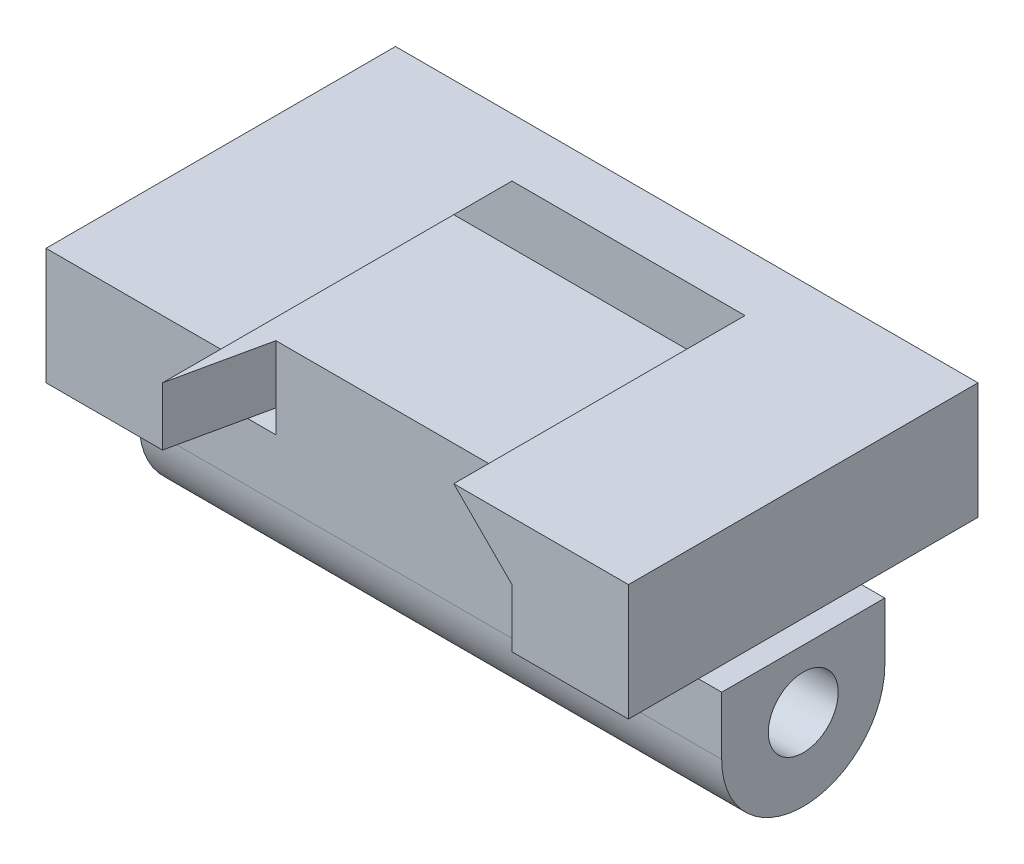
ISO-10303-21;
HEADER;
FILE_DESCRIPTION(('STEP AP214'),'2;1');
FILE_NAME('part.step','',(''),(''),'','','');
FILE_SCHEMA(('AUTOMOTIVE_DESIGN { 1 0 10303 214 1 1 1 1 }'));
ENDSEC;
DATA;
#1=APPLICATION_CONTEXT('core data for automotive mechanical design processes');
#2=APPLICATION_PROTOCOL_DEFINITION('international standard','automotive_design',2000,#1);
#3=PRODUCT_CONTEXT('',#1,'mechanical');
#4=PRODUCT('Part','Part','',(#3));
#5=PRODUCT_RELATED_PRODUCT_CATEGORY('part','',(#4));
#6=PRODUCT_DEFINITION_FORMATION('','',#4);
#7=PRODUCT_DEFINITION_CONTEXT('part definition',#1,'design');
#8=PRODUCT_DEFINITION('design','',#6,#7);
#9=PRODUCT_DEFINITION_SHAPE('','',#8);
#10=(LENGTH_UNIT() NAMED_UNIT(*) SI_UNIT(.MILLI.,.METRE.));
#11=(NAMED_UNIT(*) PLANE_ANGLE_UNIT() SI_UNIT($,.RADIAN.));
#12=(NAMED_UNIT(*) SI_UNIT($,.STERADIAN.) SOLID_ANGLE_UNIT());
#13=UNCERTAINTY_MEASURE_WITH_UNIT(LENGTH_MEASURE(1.E-05),#10,'distance_accuracy_value','');
#14=(GEOMETRIC_REPRESENTATION_CONTEXT(3) GLOBAL_UNCERTAINTY_ASSIGNED_CONTEXT((#13)) GLOBAL_UNIT_ASSIGNED_CONTEXT((#10,
#11,#12)) REPRESENTATION_CONTEXT('',''));
#15=CARTESIAN_POINT('',(0.,0.,0.));
#16=DIRECTION('',(0.,0.,1.));
#17=DIRECTION('',(1.,0.,0.));
#18=AXIS2_PLACEMENT_3D('',#15,#16,#17);
#19=CARTESIAN_POINT('',(0.,5.,0.));
#20=DIRECTION('',(0.,1.,0.));
#21=DIRECTION('',(0.,0.,1.));
#22=AXIS2_PLACEMENT_3D('',#19,#20,#21);
#23=PLANE('',#22);
#24=DIRECTION('',(-1.,0.,0.));
#25=VECTOR('',#24,1.);
#26=CARTESIAN_POINT('',(15.,5.,-10.));
#27=LINE('',#26,#25);
#28=CARTESIAN_POINT('',(15.,5.,-10.));
#29=VERTEX_POINT('',#28);
#30=CARTESIAN_POINT('',(-15.,5.,-10.));
#31=VERTEX_POINT('',#30);
#32=EDGE_CURVE('E162',#29,#31,#27,.T.);
#33=ORIENTED_EDGE('',*,*,#32,.T.);
#34=DIRECTION('',(0.,0.,1.));
#35=VECTOR('',#34,1.);
#36=CARTESIAN_POINT('',(-15.,5.,-15.));
#37=LINE('',#36,#35);
#38=CARTESIAN_POINT('',(-15.,5.,15.));
#39=VERTEX_POINT('',#38);
#40=EDGE_CURVE('E196',#31,#39,#37,.T.);
#41=ORIENTED_EDGE('',*,*,#40,.T.);
#42=DIRECTION('',(0.211772892657065,0.,-0.977318904931067));
#43=VECTOR('',#42,1.);
#44=CARTESIAN_POINT('',(-11.2227388558496,5.,-2.4318284022202));
#45=LINE('',#44,#43);
#46=CARTESIAN_POINT('',(-13.2664991614216,5.,7.));
#47=VERTEX_POINT('',#46);
#48=EDGE_CURVE('E231',#39,#47,#45,.T.);
#49=ORIENTED_EDGE('',*,*,#48,.T.);
#50=DIRECTION('',(1.,0.,0.));
#51=VECTOR('',#50,1.);
#52=CARTESIAN_POINT('',(0.,5.,7.));
#53=LINE('',#52,#51);
#54=CARTESIAN_POINT('',(13.2664991614216,5.,7.));
#55=VERTEX_POINT('',#54);
#56=EDGE_CURVE('E233',#47,#55,#53,.T.);
#57=ORIENTED_EDGE('',*,*,#56,.T.);
#58=DIRECTION('',(-0.211772892657065,0.,-0.977318904931067));
#59=VECTOR('',#58,1.);
#60=CARTESIAN_POINT('',(11.2227388558496,5.,-2.4318284022202));
#61=LINE('',#60,#59);
#62=CARTESIAN_POINT('',(15.,5.,15.));
#63=VERTEX_POINT('',#62);
#64=EDGE_CURVE('E182',#63,#55,#61,.T.);
#65=ORIENTED_EDGE('',*,*,#64,.F.);
#66=DIRECTION('',(0.,0.,1.));
#67=VECTOR('',#66,1.);
#68=CARTESIAN_POINT('',(15.,5.,-15.));
#69=LINE('',#68,#67);
#70=EDGE_CURVE('E176',#29,#63,#69,.T.);
#71=ORIENTED_EDGE('',*,*,#70,.F.);
#72=EDGE_LOOP('',(#33,#41,#49,#57,#65,#71));
#73=FACE_BOUND('',#72,.T.);
#74=ADVANCED_FACE('F38',(#73),#23,.T.);
#75=CARTESIAN_POINT('',(0.,5.,15.));
#76=DIRECTION('',(0.,0.,-1.));
#77=DIRECTION('',(-1.,0.,0.));
#78=AXIS2_PLACEMENT_3D('',#75,#76,#77);
#79=PLANE('',#78);
#80=DIRECTION('',(1.,0.,0.));
#81=VECTOR('',#80,1.);
#82=CARTESIAN_POINT('',(0.,0.,15.));
#83=LINE('',#82,#81);
#84=CARTESIAN_POINT('',(-25.,0.,15.));
#85=VERTEX_POINT('',#84);
#86=CARTESIAN_POINT('',(-15.,0.,15.));
#87=VERTEX_POINT('',#86);
#88=EDGE_CURVE('E230',#85,#87,#83,.T.);
#89=ORIENTED_EDGE('',*,*,#88,.T.);
#90=DIRECTION('',(0.,-1.,0.));
#91=VECTOR('',#90,1.);
#92=CARTESIAN_POINT('',(-15.,5.,15.));
#93=LINE('',#92,#91);
#94=EDGE_CURVE('E11',#39,#87,#93,.T.);
#95=ORIENTED_EDGE('',*,*,#94,.F.);
#96=DIRECTION('',(0.707106781186539,0.707106781186556,0.));
#97=VECTOR('',#96,1.);
#98=CARTESIAN_POINT('',(-10.0000000000002,9.99999999999994,15.));
#99=LINE('',#98,#97);
#100=CARTESIAN_POINT('',(-10.0000000000001,10.,15.));
#101=VERTEX_POINT('',#100);
#102=EDGE_CURVE('E198',#39,#101,#99,.T.);
#103=ORIENTED_EDGE('',*,*,#102,.T.);
#104=DIRECTION('',(1.,0.,0.));
#105=VECTOR('',#104,1.);
#106=CARTESIAN_POINT('',(0.,10.,15.));
#107=LINE('',#106,#105);
#108=CARTESIAN_POINT('',(-25.,10.,15.));
#109=VERTEX_POINT('',#108);
#110=EDGE_CURVE('E197',#109,#101,#107,.T.);
#111=ORIENTED_EDGE('',*,*,#110,.F.);
#112=DIRECTION('',(0.,-1.,0.));
#113=VECTOR('',#112,1.);
#114=CARTESIAN_POINT('',(-25.,5.,15.));
#115=LINE('',#114,#113);
#116=EDGE_CURVE('E237',#109,#85,#115,.T.);
#117=ORIENTED_EDGE('',*,*,#116,.T.);
#118=EDGE_LOOP('',(#89,#95,#103,#111,#117));
#119=FACE_BOUND('',#118,.T.);
#120=ADVANCED_FACE('F40',(#119),#79,.F.);
#121=CARTESIAN_POINT('',(-11.2227388558496,5.,-2.4318284022202));
#122=DIRECTION('',(-0.977318904931067,0.,-0.211772892657065));
#123=DIRECTION('',(-0.211772892657065,0.,0.977318904931067));
#124=AXIS2_PLACEMENT_3D('',#121,#122,#123);
#125=PLANE('',#124);
#126=DIRECTION('',(0.211772892657065,0.,-0.977318904931067));
#127=VECTOR('',#126,1.);
#128=CARTESIAN_POINT('',(-11.2227388558496,0.,-2.4318284022202));
#129=LINE('',#128,#127);
#130=CARTESIAN_POINT('',(-13.2664991614216,0.,7.));
#131=VERTEX_POINT('',#130);
#132=EDGE_CURVE('E240',#87,#131,#129,.T.);
#133=ORIENTED_EDGE('',*,*,#132,.T.);
#134=DIRECTION('',(0.,-1.,0.));
#135=VECTOR('',#134,1.);
#136=CARTESIAN_POINT('',(-13.2664991614216,5.,7.));
#137=LINE('',#136,#135);
#138=EDGE_CURVE('E46',#47,#131,#137,.T.);
#139=ORIENTED_EDGE('',*,*,#138,.F.);
#140=ORIENTED_EDGE('',*,*,#48,.F.);
#141=ORIENTED_EDGE('',*,*,#94,.T.);
#142=EDGE_LOOP('',(#133,#139,#140,#141));
#143=FACE_BOUND('',#142,.T.);
#144=ADVANCED_FACE('F324',(#143),#125,.F.);
#145=CARTESIAN_POINT('',(0.,5.,7.));
#146=DIRECTION('',(0.,0.,-1.));
#147=DIRECTION('',(-1.,0.,0.));
#148=AXIS2_PLACEMENT_3D('',#145,#146,#147);
#149=PLANE('',#148);
#150=ORIENTED_EDGE('',*,*,#138,.T.);
#151=DIRECTION('',(0.,1.,0.));
#152=VECTOR('',#151,1.);
#153=CARTESIAN_POINT('',(-13.2664991614216,-2.,7.));
#154=LINE('',#153,#152);
#155=CARTESIAN_POINT('',(-13.2664991614216,-2.,7.));
#156=VERTEX_POINT('',#155);
#157=EDGE_CURVE('E221',#156,#131,#154,.T.);
#158=ORIENTED_EDGE('',*,*,#157,.F.);
#159=DIRECTION('',(1.,0.,0.));
#160=VECTOR('',#159,1.);
#161=CARTESIAN_POINT('',(-25.,-2.,7.00000000000001));
#162=LINE('',#161,#160);
#163=CARTESIAN_POINT('',(-25.,-2.,7.00000000000001));
#164=VERTEX_POINT('',#163);
#165=EDGE_CURVE('E283',#164,#156,#162,.T.);
#166=ORIENTED_EDGE('',*,*,#165,.F.);
#167=DIRECTION('',(0.,-1.,0.));
#168=VECTOR('',#167,1.);
#169=CARTESIAN_POINT('',(-25.,-7.,7.00000000000001));
#170=LINE('',#169,#168);
#171=CARTESIAN_POINT('',(-25.,-7.,7.00000000000001));
#172=VERTEX_POINT('',#171);
#173=EDGE_CURVE('E300',#164,#172,#170,.T.);
#174=ORIENTED_EDGE('',*,*,#173,.T.);
#175=DIRECTION('',(1.,0.,0.));
#176=VECTOR('',#175,1.);
#177=CARTESIAN_POINT('',(-25.,-7.,7.00000000000001));
#178=LINE('',#177,#176);
#179=CARTESIAN_POINT('',(25.,-7.,7.00000000000001));
#180=VERTEX_POINT('',#179);
#181=EDGE_CURVE('E289',#172,#180,#178,.T.);
#182=ORIENTED_EDGE('',*,*,#181,.T.);
#183=DIRECTION('',(0.,-1.,0.));
#184=VECTOR('',#183,1.);
#185=CARTESIAN_POINT('',(25.,-7.,7.00000000000001));
#186=LINE('',#185,#184);
#187=CARTESIAN_POINT('',(25.,-2.,7.00000000000001));
#188=VERTEX_POINT('',#187);
#189=EDGE_CURVE('E342',#188,#180,#186,.T.);
#190=ORIENTED_EDGE('',*,*,#189,.F.);
#191=CARTESIAN_POINT('',(13.2664991614216,-2.,7.));
#192=VERTEX_POINT('',#191);
#193=EDGE_CURVE('E290',#192,#188,#162,.T.);
#194=ORIENTED_EDGE('',*,*,#193,.F.);
#195=DIRECTION('',(0.,1.,0.));
#196=VECTOR('',#195,1.);
#197=CARTESIAN_POINT('',(13.2664991614216,-2.,7.));
#198=LINE('',#197,#196);
#199=CARTESIAN_POINT('',(13.2664991614216,0.,7.));
#200=VERTEX_POINT('',#199);
#201=EDGE_CURVE('E224',#192,#200,#198,.T.);
#202=ORIENTED_EDGE('',*,*,#201,.T.);
#203=DIRECTION('',(0.,-1.,0.));
#204=VECTOR('',#203,1.);
#205=CARTESIAN_POINT('',(13.2664991614216,5.,7.));
#206=LINE('',#205,#204);
#207=EDGE_CURVE('E265',#55,#200,#206,.T.);
#208=ORIENTED_EDGE('',*,*,#207,.F.);
#209=ORIENTED_EDGE('',*,*,#56,.F.);
#210=EDGE_LOOP('',(#150,#158,#166,#174,#182,#190,#194,#202,#208,#209));
#211=FACE_BOUND('',#210,.T.);
#212=ADVANCED_FACE('F271',(#211),#149,.F.);
#213=CARTESIAN_POINT('',(11.2227388558496,5.,-2.4318284022202));
#214=DIRECTION('',(-0.977318904931067,0.,0.211772892657065));
#215=DIRECTION('',(0.211772892657065,0.,0.977318904931067));
#216=AXIS2_PLACEMENT_3D('',#213,#214,#215);
#217=PLANE('',#216);
#218=DIRECTION('',(-0.211772892657065,0.,-0.977318904931067));
#219=VECTOR('',#218,1.);
#220=CARTESIAN_POINT('',(11.2227388558496,0.,-2.4318284022202));
#221=LINE('',#220,#219);
#222=CARTESIAN_POINT('',(15.,0.,15.));
#223=VERTEX_POINT('',#222);
#224=EDGE_CURVE('E243',#223,#200,#221,.T.);
#225=ORIENTED_EDGE('',*,*,#224,.F.);
#226=DIRECTION('',(0.,-1.,0.));
#227=VECTOR('',#226,1.);
#228=CARTESIAN_POINT('',(15.,5.,15.));
#229=LINE('',#228,#227);
#230=EDGE_CURVE('E263',#63,#223,#229,.T.);
#231=ORIENTED_EDGE('',*,*,#230,.F.);
#232=ORIENTED_EDGE('',*,*,#64,.T.);
#233=ORIENTED_EDGE('',*,*,#207,.T.);
#234=EDGE_LOOP('',(#225,#231,#232,#233));
#235=FACE_BOUND('',#234,.T.);
#236=ADVANCED_FACE('F376',(#235),#217,.T.);
#237=CARTESIAN_POINT('',(0.,5.,15.));
#238=DIRECTION('',(0.,0.,1.));
#239=DIRECTION('',(1.,0.,0.));
#240=AXIS2_PLACEMENT_3D('',#237,#238,#239);
#241=PLANE('',#240);
#242=DIRECTION('',(-1.,0.,0.));
#243=VECTOR('',#242,1.);
#244=CARTESIAN_POINT('',(0.,0.,15.));
#245=LINE('',#244,#243);
#246=CARTESIAN_POINT('',(25.,0.,15.));
#247=VERTEX_POINT('',#246);
#248=EDGE_CURVE('E245',#247,#223,#245,.T.);
#249=ORIENTED_EDGE('',*,*,#248,.F.);
#250=DIRECTION('',(0.,-1.,0.));
#251=VECTOR('',#250,1.);
#252=CARTESIAN_POINT('',(25.,5.,15.));
#253=LINE('',#252,#251);
#254=CARTESIAN_POINT('',(25.,10.,15.));
#255=VERTEX_POINT('',#254);
#256=EDGE_CURVE('E261',#255,#247,#253,.T.);
#257=ORIENTED_EDGE('',*,*,#256,.F.);
#258=DIRECTION('',(1.,0.,0.));
#259=VECTOR('',#258,1.);
#260=CARTESIAN_POINT('',(0.,10.,15.));
#261=LINE('',#260,#259);
#262=CARTESIAN_POINT('',(10.0000000000001,10.,15.));
#263=VERTEX_POINT('',#262);
#264=EDGE_CURVE('E185',#263,#255,#261,.T.);
#265=ORIENTED_EDGE('',*,*,#264,.F.);
#266=DIRECTION('',(-0.707106781186539,0.707106781186556,0.));
#267=VECTOR('',#266,1.);
#268=CARTESIAN_POINT('',(10.0000000000002,9.99999999999994,15.));
#269=LINE('',#268,#267);
#270=EDGE_CURVE('E190',#63,#263,#269,.T.);
#271=ORIENTED_EDGE('',*,*,#270,.F.);
#272=ORIENTED_EDGE('',*,*,#230,.T.);
#273=EDGE_LOOP('',(#249,#257,#265,#271,#272));
#274=FACE_BOUND('',#273,.T.);
#275=ADVANCED_FACE('F306',(#274),#241,.T.);
#276=CARTESIAN_POINT('',(25.,5.,0.));
#277=DIRECTION('',(1.,0.,0.));
#278=DIRECTION('',(0.,0.,-1.));
#279=AXIS2_PLACEMENT_3D('',#276,#277,#278);
#280=PLANE('',#279);
#281=DIRECTION('',(0.,0.,1.));
#282=VECTOR('',#281,1.);
#283=CARTESIAN_POINT('',(25.,0.,0.));
#284=LINE('',#283,#282);
#285=CARTESIAN_POINT('',(25.,0.,-15.));
#286=VERTEX_POINT('',#285);
#287=EDGE_CURVE('E248',#286,#247,#284,.T.);
#288=ORIENTED_EDGE('',*,*,#287,.F.);
#289=DIRECTION('',(0.,-1.,0.));
#290=VECTOR('',#289,1.);
#291=CARTESIAN_POINT('',(25.,5.,-15.));
#292=LINE('',#291,#290);
#293=CARTESIAN_POINT('',(25.,10.,-15.));
#294=VERTEX_POINT('',#293);
#295=EDGE_CURVE('E259',#294,#286,#292,.T.);
#296=ORIENTED_EDGE('',*,*,#295,.F.);
#297=DIRECTION('',(0.,0.,1.));
#298=VECTOR('',#297,1.);
#299=CARTESIAN_POINT('',(25.,10.,-15.));
#300=LINE('',#299,#298);
#301=EDGE_CURVE('E184',#294,#255,#300,.T.);
#302=ORIENTED_EDGE('',*,*,#301,.T.);
#303=ORIENTED_EDGE('',*,*,#256,.T.);
#304=EDGE_LOOP('',(#288,#296,#302,#303));
#305=FACE_BOUND('',#304,.T.);
#306=ADVANCED_FACE('F310',(#305),#280,.T.);
#307=CARTESIAN_POINT('',(0.,5.,-15.));
#308=DIRECTION('',(0.,0.,1.));
#309=DIRECTION('',(1.,0.,0.));
#310=AXIS2_PLACEMENT_3D('',#307,#308,#309);
#311=PLANE('',#310);
#312=DIRECTION('',(1.,0.,0.));
#313=VECTOR('',#312,1.);
#314=CARTESIAN_POINT('',(0.,10.,-15.));
#315=LINE('',#314,#313);
#316=CARTESIAN_POINT('',(-25.,10.,-15.));
#317=VERTEX_POINT('',#316);
#318=EDGE_CURVE('E194',#317,#294,#315,.T.);
#319=ORIENTED_EDGE('',*,*,#318,.T.);
#320=ORIENTED_EDGE('',*,*,#295,.T.);
#321=DIRECTION('',(-1.,0.,0.));
#322=VECTOR('',#321,1.);
#323=CARTESIAN_POINT('',(0.,0.,-15.));
#324=LINE('',#323,#322);
#325=CARTESIAN_POINT('',(-25.,0.,-15.));
#326=VERTEX_POINT('',#325);
#327=EDGE_CURVE('E251',#286,#326,#324,.T.);
#328=ORIENTED_EDGE('',*,*,#327,.T.);
#329=DIRECTION('',(0.,-1.,0.));
#330=VECTOR('',#329,1.);
#331=CARTESIAN_POINT('',(-25.,5.,-15.));
#332=LINE('',#331,#330);
#333=EDGE_CURVE('E256',#317,#326,#332,.T.);
#334=ORIENTED_EDGE('',*,*,#333,.F.);
#335=EDGE_LOOP('',(#319,#320,#328,#334));
#336=FACE_BOUND('',#335,.T.);
#337=ADVANCED_FACE('F315',(#336),#311,.F.);
#338=CARTESIAN_POINT('',(-25.,5.,0.));
#339=DIRECTION('',(1.,0.,0.));
#340=DIRECTION('',(0.,0.,-1.));
#341=AXIS2_PLACEMENT_3D('',#338,#339,#340);
#342=PLANE('',#341);
#343=DIRECTION('',(0.,0.,1.));
#344=VECTOR('',#343,1.);
#345=CARTESIAN_POINT('',(-25.,0.,0.));
#346=LINE('',#345,#344);
#347=EDGE_CURVE('E234',#326,#85,#346,.T.);
#348=ORIENTED_EDGE('',*,*,#347,.T.);
#349=ORIENTED_EDGE('',*,*,#116,.F.);
#350=DIRECTION('',(0.,0.,1.));
#351=VECTOR('',#350,1.);
#352=CARTESIAN_POINT('',(-25.,10.,-15.));
#353=LINE('',#352,#351);
#354=EDGE_CURVE('E203',#317,#109,#353,.T.);
#355=ORIENTED_EDGE('',*,*,#354,.F.);
#356=ORIENTED_EDGE('',*,*,#333,.T.);
#357=EDGE_LOOP('',(#348,#349,#355,#356));
#358=FACE_BOUND('',#357,.T.);
#359=ADVANCED_FACE('F319',(#358),#342,.F.);
#360=CARTESIAN_POINT('',(0.,0.,0.));
#361=DIRECTION('',(0.,1.,0.));
#362=DIRECTION('',(0.,0.,1.));
#363=AXIS2_PLACEMENT_3D('',#360,#361,#362);
#364=PLANE('',#363);
#365=CARTESIAN_POINT('',(0.,0.,0.));
#366=DIRECTION('',(0.,-1.,0.));
#367=DIRECTION('',(0.,0.,-1.));
#368=AXIS2_PLACEMENT_3D('',#365,#366,#367);
#369=CIRCLE('',#368,15.);
#370=CARTESIAN_POINT('',(-13.2664991614216,0.,-7.));
#371=VERTEX_POINT('',#370);
#372=EDGE_CURVE('E213',#131,#371,#369,.T.);
#373=ORIENTED_EDGE('',*,*,#372,.F.);
#374=ORIENTED_EDGE('',*,*,#132,.F.);
#375=ORIENTED_EDGE('',*,*,#88,.F.);
#376=ORIENTED_EDGE('',*,*,#347,.F.);
#377=ORIENTED_EDGE('',*,*,#327,.F.);
#378=ORIENTED_EDGE('',*,*,#287,.T.);
#379=ORIENTED_EDGE('',*,*,#248,.T.);
#380=ORIENTED_EDGE('',*,*,#224,.T.);
#381=CARTESIAN_POINT('',(13.2664991614216,0.,-7.));
#382=VERTEX_POINT('',#381);
#383=EDGE_CURVE('E215',#382,#200,#369,.T.);
#384=ORIENTED_EDGE('',*,*,#383,.F.);
#385=DIRECTION('',(1.,0.,0.));
#386=VECTOR('',#385,1.);
#387=CARTESIAN_POINT('',(0.,0.,-7.));
#388=LINE('',#387,#386);
#389=EDGE_CURVE('E61',#371,#382,#388,.T.);
#390=ORIENTED_EDGE('',*,*,#389,.F.);
#391=EDGE_LOOP('',(#373,#374,#375,#376,#377,#378,#379,#380,#384,#390));
#392=FACE_BOUND('',#391,.T.);
#393=ADVANCED_FACE('F323',(#392),#364,.F.);
#394=CARTESIAN_POINT('',(0.,-2.,-7.));
#395=DIRECTION('',(0.,0.,1.));
#396=DIRECTION('',(1.,0.,0.));
#397=AXIS2_PLACEMENT_3D('',#394,#395,#396);
#398=PLANE('',#397);
#399=ORIENTED_EDGE('',*,*,#389,.T.);
#400=DIRECTION('',(0.,1.,0.));
#401=VECTOR('',#400,1.);
#402=CARTESIAN_POINT('',(13.2664991614216,-2.,-7.));
#403=LINE('',#402,#401);
#404=CARTESIAN_POINT('',(13.2664991614216,-2.,-7.));
#405=VERTEX_POINT('',#404);
#406=EDGE_CURVE('E227',#405,#382,#403,.T.);
#407=ORIENTED_EDGE('',*,*,#406,.F.);
#408=DIRECTION('',(1.,0.,0.));
#409=VECTOR('',#408,1.);
#410=CARTESIAN_POINT('',(-25.,-2.,-6.99999999999999));
#411=LINE('',#410,#409);
#412=CARTESIAN_POINT('',(25.,-2.,-6.99999999999999));
#413=VERTEX_POINT('',#412);
#414=EDGE_CURVE('E297',#405,#413,#411,.T.);
#415=ORIENTED_EDGE('',*,*,#414,.T.);
#416=DIRECTION('',(0.,1.,0.));
#417=VECTOR('',#416,1.);
#418=CARTESIAN_POINT('',(25.,-2.,-6.99999999999999));
#419=LINE('',#418,#417);
#420=CARTESIAN_POINT('',(25.,-7.,-6.99999999999999));
#421=VERTEX_POINT('',#420);
#422=EDGE_CURVE('E349',#421,#413,#419,.T.);
#423=ORIENTED_EDGE('',*,*,#422,.F.);
#424=DIRECTION('',(1.,0.,0.));
#425=VECTOR('',#424,1.);
#426=CARTESIAN_POINT('',(-25.,-7.,-6.99999999999999));
#427=LINE('',#426,#425);
#428=CARTESIAN_POINT('',(-25.,-7.,-6.99999999999999));
#429=VERTEX_POINT('',#428);
#430=EDGE_CURVE('E298',#429,#421,#427,.T.);
#431=ORIENTED_EDGE('',*,*,#430,.F.);
#432=DIRECTION('',(0.,1.,0.));
#433=VECTOR('',#432,1.);
#434=CARTESIAN_POINT('',(-25.,-2.,-6.99999999999999));
#435=LINE('',#434,#433);
#436=CARTESIAN_POINT('',(-25.,-2.,-6.99999999999999));
#437=VERTEX_POINT('',#436);
#438=EDGE_CURVE('E341',#429,#437,#435,.T.);
#439=ORIENTED_EDGE('',*,*,#438,.T.);
#440=CARTESIAN_POINT('',(-13.2664991614216,-2.,-6.99999999999999));
#441=VERTEX_POINT('',#440);
#442=EDGE_CURVE('E293',#437,#441,#411,.T.);
#443=ORIENTED_EDGE('',*,*,#442,.T.);
#444=DIRECTION('',(0.,1.,0.));
#445=VECTOR('',#444,1.);
#446=CARTESIAN_POINT('',(-13.2664991614216,-2.,-7.));
#447=LINE('',#446,#445);
#448=EDGE_CURVE('E218',#441,#371,#447,.T.);
#449=ORIENTED_EDGE('',*,*,#448,.T.);
#450=EDGE_LOOP('',(#399,#407,#415,#423,#431,#439,#443,#449));
#451=FACE_BOUND('',#450,.T.);
#452=ADVANCED_FACE('F367',(#451),#398,.F.);
#453=CARTESIAN_POINT('',(0.,-2.,0.));
#454=DIRECTION('',(0.,1.,0.));
#455=DIRECTION('',(0.,0.,1.));
#456=AXIS2_PLACEMENT_3D('',#453,#454,#455);
#457=CYLINDRICAL_SURFACE('',#456,15.);
#458=ORIENTED_EDGE('',*,*,#383,.T.);
#459=ORIENTED_EDGE('',*,*,#201,.F.);
#460=CARTESIAN_POINT('',(0.,-2.,0.));
#461=DIRECTION('',(0.,-1.,0.));
#462=DIRECTION('',(0.,0.,-1.));
#463=AXIS2_PLACEMENT_3D('',#460,#461,#462);
#464=CIRCLE('',#463,15.);
#465=EDGE_CURVE('E209',#405,#192,#464,.T.);
#466=ORIENTED_EDGE('',*,*,#465,.F.);
#467=ORIENTED_EDGE('',*,*,#406,.T.);
#468=EDGE_LOOP('',(#458,#459,#466,#467));
#469=FACE_BOUND('',#468,.T.);
#470=ADVANCED_FACE('F373',(#469),#457,.T.);
#471=ORIENTED_EDGE('',*,*,#372,.T.);
#472=ORIENTED_EDGE('',*,*,#448,.F.);
#473=EDGE_CURVE('E212',#156,#441,#464,.T.);
#474=ORIENTED_EDGE('',*,*,#473,.F.);
#475=ORIENTED_EDGE('',*,*,#157,.T.);
#476=EDGE_LOOP('',(#471,#472,#474,#475));
#477=FACE_BOUND('',#476,.T.);
#478=ADVANCED_FACE('F277',(#477),#457,.T.);
#479=CARTESIAN_POINT('',(0.,10.,-15.));
#480=DIRECTION('',(0.,-1.,0.));
#481=DIRECTION('',(0.,0.,-1.));
#482=AXIS2_PLACEMENT_3D('',#479,#480,#481);
#483=PLANE('',#482);
#484=ORIENTED_EDGE('',*,*,#110,.T.);
#485=DIRECTION('',(0.,0.,1.));
#486=VECTOR('',#485,1.);
#487=CARTESIAN_POINT('',(-10.0000000000001,10.,-15.));
#488=LINE('',#487,#486);
#489=CARTESIAN_POINT('',(-10.0000000000001,10.,-10.));
#490=VERTEX_POINT('',#489);
#491=EDGE_CURVE('E206',#490,#101,#488,.T.);
#492=ORIENTED_EDGE('',*,*,#491,.F.);
#493=DIRECTION('',(1.,0.,0.));
#494=VECTOR('',#493,1.);
#495=CARTESIAN_POINT('',(-10.0000000000001,10.,-10.));
#496=LINE('',#495,#494);
#497=CARTESIAN_POINT('',(10.0000000000001,10.,-10.));
#498=VERTEX_POINT('',#497);
#499=EDGE_CURVE('E53',#490,#498,#496,.T.);
#500=ORIENTED_EDGE('',*,*,#499,.T.);
#501=DIRECTION('',(0.,0.,1.));
#502=VECTOR('',#501,1.);
#503=CARTESIAN_POINT('',(10.0000000000001,10.,-15.));
#504=LINE('',#503,#502);
#505=EDGE_CURVE('E178',#498,#263,#504,.T.);
#506=ORIENTED_EDGE('',*,*,#505,.T.);
#507=ORIENTED_EDGE('',*,*,#264,.T.);
#508=ORIENTED_EDGE('',*,*,#301,.F.);
#509=ORIENTED_EDGE('',*,*,#318,.F.);
#510=ORIENTED_EDGE('',*,*,#354,.T.);
#511=EDGE_LOOP('',(#484,#492,#500,#506,#507,#508,#509,#510));
#512=FACE_BOUND('',#511,.T.);
#513=ADVANCED_FACE('F302',(#512),#483,.F.);
#514=CARTESIAN_POINT('',(-10.0000000000002,9.99999999999994,-15.));
#515=DIRECTION('',(0.707106781186556,-0.707106781186539,0.));
#516=DIRECTION('',(0.707106781186539,0.707106781186556,0.));
#517=AXIS2_PLACEMENT_3D('',#514,#515,#516);
#518=PLANE('',#517);
#519=DIRECTION('',(0.707106781186539,0.707106781186556,0.));
#520=VECTOR('',#519,1.);
#521=CARTESIAN_POINT('',(-15.,5.,-10.));
#522=LINE('',#521,#520);
#523=EDGE_CURVE('E168',#31,#490,#522,.T.);
#524=ORIENTED_EDGE('',*,*,#523,.T.);
#525=ORIENTED_EDGE('',*,*,#491,.T.);
#526=ORIENTED_EDGE('',*,*,#102,.F.);
#527=ORIENTED_EDGE('',*,*,#40,.F.);
#528=EDGE_LOOP('',(#524,#525,#526,#527));
#529=FACE_BOUND('',#528,.T.);
#530=ADVANCED_FACE('F327',(#529),#518,.T.);
#531=CARTESIAN_POINT('',(10.0000000000002,9.99999999999994,-15.));
#532=DIRECTION('',(0.707106781186556,0.707106781186539,0.));
#533=DIRECTION('',(-0.707106781186539,0.707106781186556,0.));
#534=AXIS2_PLACEMENT_3D('',#531,#532,#533);
#535=PLANE('',#534);
#536=ORIENTED_EDGE('',*,*,#505,.F.);
#537=DIRECTION('',(0.707106781186539,-0.707106781186556,0.));
#538=VECTOR('',#537,1.);
#539=CARTESIAN_POINT('',(10.0000000000001,10.,-10.));
#540=LINE('',#539,#538);
#541=EDGE_CURVE('E165',#498,#29,#540,.T.);
#542=ORIENTED_EDGE('',*,*,#541,.T.);
#543=ORIENTED_EDGE('',*,*,#70,.T.);
#544=ORIENTED_EDGE('',*,*,#270,.T.);
#545=EDGE_LOOP('',(#536,#542,#543,#544));
#546=FACE_BOUND('',#545,.T.);
#547=ADVANCED_FACE('F174',(#546),#535,.F.);
#548=CARTESIAN_POINT('',(-25.,-2.,7.00000000000001));
#549=DIRECTION('',(0.,1.,0.));
#550=DIRECTION('',(0.,0.,1.));
#551=AXIS2_PLACEMENT_3D('',#548,#549,#550);
#552=PLANE('',#551);
#553=ORIENTED_EDGE('',*,*,#414,.F.);
#554=ORIENTED_EDGE('',*,*,#465,.T.);
#555=ORIENTED_EDGE('',*,*,#193,.T.);
#556=DIRECTION('',(0.,0.,1.));
#557=VECTOR('',#556,1.);
#558=CARTESIAN_POINT('',(25.,-2.,7.00000000000001));
#559=LINE('',#558,#557);
#560=EDGE_CURVE('E352',#413,#188,#559,.T.);
#561=ORIENTED_EDGE('',*,*,#560,.F.);
#562=EDGE_LOOP('',(#553,#554,#555,#561));
#563=FACE_BOUND('',#562,.T.);
#564=ADVANCED_FACE('F371',(#563),#552,.T.);
#565=CARTESIAN_POINT('',(-25.,-7.,0.));
#566=DIRECTION('',(1.,0.,0.));
#567=DIRECTION('',(0.,0.,-1.));
#568=AXIS2_PLACEMENT_3D('',#565,#566,#567);
#569=CYLINDRICAL_SURFACE('',#568,7.);
#570=CARTESIAN_POINT('',(25.,-7.,0.));
#571=DIRECTION('',(1.,0.,0.));
#572=DIRECTION('',(0.,0.,-1.));
#573=AXIS2_PLACEMENT_3D('',#570,#571,#572);
#574=CIRCLE('',#573,7.);
#575=EDGE_CURVE('E335',#180,#421,#574,.T.);
#576=ORIENTED_EDGE('',*,*,#575,.F.);
#577=ORIENTED_EDGE('',*,*,#181,.F.);
#578=CARTESIAN_POINT('',(-25.,-7.,0.));
#579=DIRECTION('',(1.,0.,0.));
#580=DIRECTION('',(0.,0.,-1.));
#581=AXIS2_PLACEMENT_3D('',#578,#579,#580);
#582=CIRCLE('',#581,7.);
#583=EDGE_CURVE('E338',#172,#429,#582,.T.);
#584=ORIENTED_EDGE('',*,*,#583,.T.);
#585=ORIENTED_EDGE('',*,*,#430,.T.);
#586=EDGE_LOOP('',(#576,#577,#584,#585));
#587=FACE_BOUND('',#586,.T.);
#588=ADVANCED_FACE('F363',(#587),#569,.T.);
#589=ORIENTED_EDGE('',*,*,#165,.T.);
#590=ORIENTED_EDGE('',*,*,#473,.T.);
#591=ORIENTED_EDGE('',*,*,#442,.F.);
#592=DIRECTION('',(0.,0.,1.));
#593=VECTOR('',#592,1.);
#594=CARTESIAN_POINT('',(-25.,-2.,7.00000000000001));
#595=LINE('',#594,#593);
#596=EDGE_CURVE('E286',#437,#164,#595,.T.);
#597=ORIENTED_EDGE('',*,*,#596,.T.);
#598=EDGE_LOOP('',(#589,#590,#591,#597));
#599=FACE_BOUND('',#598,.T.);
#600=ADVANCED_FACE('F284',(#599),#552,.T.);
#601=CARTESIAN_POINT('',(-25.,-7.,0.));
#602=DIRECTION('',(1.,0.,0.));
#603=DIRECTION('',(0.,0.,-1.));
#604=AXIS2_PLACEMENT_3D('',#601,#602,#603);
#605=PLANE('',#604);
#606=CARTESIAN_POINT('',(-25.,-7.,0.));
#607=DIRECTION('',(1.,0.,0.));
#608=DIRECTION('',(0.,0.,-1.));
#609=AXIS2_PLACEMENT_3D('',#606,#607,#608);
#610=CIRCLE('',#609,3.);
#611=CARTESIAN_POINT('',(-25.,-7.,-2.99999999999999));
#612=VERTEX_POINT('',#611);
#613=EDGE_CURVE('E332',#612,#612,#610,.T.);
#614=ORIENTED_EDGE('',*,*,#613,.T.);
#615=EDGE_LOOP('',(#614));
#616=FACE_BOUND('',#615,.T.);
#617=ORIENTED_EDGE('',*,*,#583,.F.);
#618=ORIENTED_EDGE('',*,*,#173,.F.);
#619=ORIENTED_EDGE('',*,*,#596,.F.);
#620=ORIENTED_EDGE('',*,*,#438,.F.);
#621=EDGE_LOOP('',(#617,#618,#619,#620));
#622=FACE_BOUND('',#621,.T.);
#623=ADVANCED_FACE('F470',(#616,#622),#605,.F.);
#624=CARTESIAN_POINT('',(25.,-7.,0.));
#625=DIRECTION('',(1.,0.,0.));
#626=DIRECTION('',(0.,0.,-1.));
#627=AXIS2_PLACEMENT_3D('',#624,#625,#626);
#628=PLANE('',#627);
#629=CARTESIAN_POINT('',(25.,-7.,0.));
#630=DIRECTION('',(1.,0.,0.));
#631=DIRECTION('',(0.,0.,-1.));
#632=AXIS2_PLACEMENT_3D('',#629,#630,#631);
#633=CIRCLE('',#632,3.);
#634=CARTESIAN_POINT('',(25.,-7.,-2.99999999999999));
#635=VERTEX_POINT('',#634);
#636=EDGE_CURVE('E329',#635,#635,#633,.T.);
#637=ORIENTED_EDGE('',*,*,#636,.F.);
#638=EDGE_LOOP('',(#637));
#639=FACE_BOUND('',#638,.T.);
#640=ORIENTED_EDGE('',*,*,#575,.T.);
#641=ORIENTED_EDGE('',*,*,#422,.T.);
#642=ORIENTED_EDGE('',*,*,#560,.T.);
#643=ORIENTED_EDGE('',*,*,#189,.T.);
#644=EDGE_LOOP('',(#640,#641,#642,#643));
#645=FACE_BOUND('',#644,.T.);
#646=ADVANCED_FACE('F357',(#639,#645),#628,.T.);
#647=CARTESIAN_POINT('',(-25.,-7.,0.));
#648=DIRECTION('',(1.,0.,0.));
#649=DIRECTION('',(0.,0.,-1.));
#650=AXIS2_PLACEMENT_3D('',#647,#648,#649);
#651=CYLINDRICAL_SURFACE('',#650,3.);
#652=ORIENTED_EDGE('',*,*,#613,.F.);
#653=EDGE_LOOP('',(#652));
#654=FACE_BOUND('',#653,.T.);
#655=ORIENTED_EDGE('',*,*,#636,.T.);
#656=EDGE_LOOP('',(#655));
#657=FACE_BOUND('',#656,.T.);
#658=ADVANCED_FACE('F483',(#654,#657),#651,.F.);
#659=CARTESIAN_POINT('',(0.,0.,-10.));
#660=DIRECTION('',(0.,0.,1.));
#661=DIRECTION('',(1.,0.,0.));
#662=AXIS2_PLACEMENT_3D('',#659,#660,#661);
#663=PLANE('',#662);
#664=ORIENTED_EDGE('',*,*,#541,.F.);
#665=ORIENTED_EDGE('',*,*,#499,.F.);
#666=ORIENTED_EDGE('',*,*,#523,.F.);
#667=ORIENTED_EDGE('',*,*,#32,.F.);
#668=EDGE_LOOP('',(#664,#665,#666,#667));
#669=FACE_BOUND('',#668,.T.);
#670=ADVANCED_FACE('F164',(#669),#663,.T.);
#671=CLOSED_SHELL('',(#74,#120,#144,#212,#236,#275,#306,#337,#359,#393,#452,#470,#478,#513,#530,
#547,#564,#588,#600,#623,#646,#658,#670));
#672=MANIFOLD_SOLID_BREP('B2',#671);
#673=ADVANCED_BREP_SHAPE_REPRESENTATION('',(#18,#672),#14);
#674=SHAPE_DEFINITION_REPRESENTATION(#9,#673);
ENDSEC;
END-ISO-10303-21;
